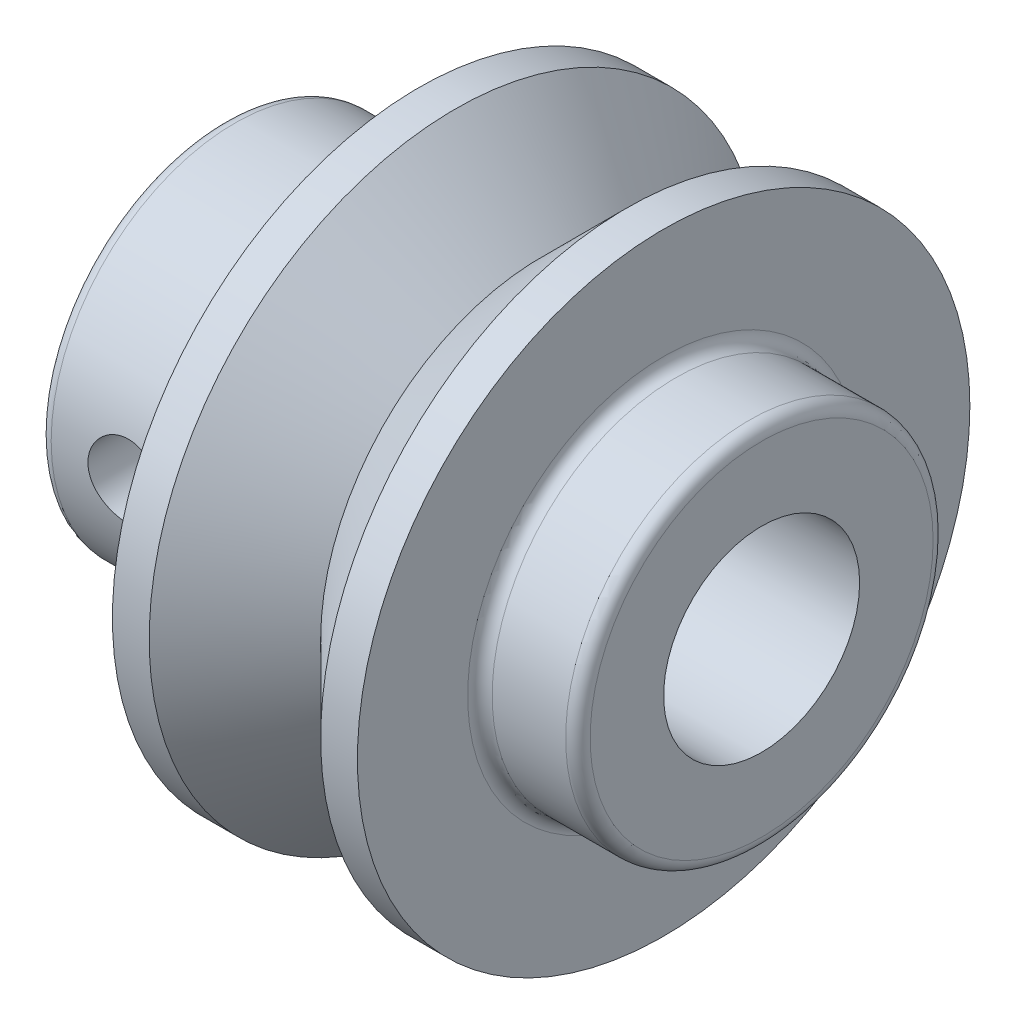
ISO-10303-21;
HEADER;
FILE_DESCRIPTION(('STEP AP214'),'2;1');
FILE_NAME('part.step','',(''),(''),'','','');
FILE_SCHEMA(('AUTOMOTIVE_DESIGN { 1 0 10303 214 1 1 1 1 }'));
ENDSEC;
DATA;
#1=APPLICATION_CONTEXT('core data for automotive mechanical design processes');
#2=APPLICATION_PROTOCOL_DEFINITION('international standard','automotive_design',2000,#1);
#3=PRODUCT_CONTEXT('',#1,'mechanical');
#4=PRODUCT('Part','Part','',(#3));
#5=PRODUCT_RELATED_PRODUCT_CATEGORY('part','',(#4));
#6=PRODUCT_DEFINITION_FORMATION('','',#4);
#7=PRODUCT_DEFINITION_CONTEXT('part definition',#1,'design');
#8=PRODUCT_DEFINITION('design','',#6,#7);
#9=PRODUCT_DEFINITION_SHAPE('','',#8);
#10=(LENGTH_UNIT() NAMED_UNIT(*) SI_UNIT(.MILLI.,.METRE.));
#11=(NAMED_UNIT(*) PLANE_ANGLE_UNIT() SI_UNIT($,.RADIAN.));
#12=(NAMED_UNIT(*) SI_UNIT($,.STERADIAN.) SOLID_ANGLE_UNIT());
#13=UNCERTAINTY_MEASURE_WITH_UNIT(LENGTH_MEASURE(1.E-05),#10,'distance_accuracy_value','');
#14=(GEOMETRIC_REPRESENTATION_CONTEXT(3) GLOBAL_UNCERTAINTY_ASSIGNED_CONTEXT((#13)) GLOBAL_UNIT_ASSIGNED_CONTEXT((#10,
#11,#12)) REPRESENTATION_CONTEXT('',''));
#15=CARTESIAN_POINT('',(0.,0.,0.));
#16=DIRECTION('',(0.,0.,1.));
#17=DIRECTION('',(1.,0.,0.));
#18=AXIS2_PLACEMENT_3D('',#15,#16,#17);
#19=CARTESIAN_POINT('',(0.,0.,0.));
#20=DIRECTION('',(-1.,0.,0.));
#21=DIRECTION('',(0.,0.,1.));
#22=AXIS2_PLACEMENT_3D('',#19,#20,#21);
#23=PLANE('',#22);
#24=CARTESIAN_POINT('',(0.,0.,0.));
#25=DIRECTION('',(-1.,0.,0.));
#26=DIRECTION('',(0.,0.,1.));
#27=AXIS2_PLACEMENT_3D('',#24,#25,#26);
#28=CIRCLE('',#27,7.);
#29=CARTESIAN_POINT('',(0.,0.,7.));
#30=VERTEX_POINT('',#29);
#31=EDGE_CURVE('E55',#30,#30,#28,.T.);
#32=ORIENTED_EDGE('',*,*,#31,.T.);
#33=EDGE_LOOP('',(#32));
#34=FACE_BOUND('',#33,.T.);
#35=CARTESIAN_POINT('',(0.,0.,0.));
#36=DIRECTION('',(1.,0.,0.));
#37=DIRECTION('',(0.,0.,-1.));
#38=AXIS2_PLACEMENT_3D('',#35,#36,#37);
#39=CIRCLE('',#38,4.);
#40=CARTESIAN_POINT('',(0.,0.,-4.));
#41=VERTEX_POINT('',#40);
#42=EDGE_CURVE('E183',#41,#41,#39,.T.);
#43=ORIENTED_EDGE('',*,*,#42,.T.);
#44=EDGE_LOOP('',(#43));
#45=FACE_BOUND('',#44,.T.);
#46=ADVANCED_FACE('F35',(#34,#45),#23,.T.);
#47=CARTESIAN_POINT('',(22.,0.,0.));
#48=DIRECTION('',(1.,0.,0.));
#49=DIRECTION('',(0.,0.,-1.));
#50=AXIS2_PLACEMENT_3D('',#47,#48,#49);
#51=CYLINDRICAL_SURFACE('',#50,7.5);
#52=CARTESIAN_POINT('',(7.5,0.,0.));
#53=DIRECTION('',(-1.,0.,0.));
#54=DIRECTION('',(0.,0.,1.));
#55=AXIS2_PLACEMENT_3D('',#52,#53,#54);
#56=CIRCLE('',#55,7.5);
#57=CARTESIAN_POINT('',(7.5,0.,7.5));
#58=VERTEX_POINT('',#57);
#59=EDGE_CURVE('E58',#58,#58,#56,.T.);
#60=ORIENTED_EDGE('',*,*,#59,.T.);
#61=EDGE_LOOP('',(#60));
#62=FACE_BOUND('',#61,.T.);
#63=CARTESIAN_POINT('',(0.5,0.,0.));
#64=DIRECTION('',(-1.,0.,0.));
#65=DIRECTION('',(0.,0.,1.));
#66=AXIS2_PLACEMENT_3D('',#63,#64,#65);
#67=CIRCLE('',#66,7.5);
#68=CARTESIAN_POINT('',(0.5,0.,7.5));
#69=VERTEX_POINT('',#68);
#70=EDGE_CURVE('E61',#69,#69,#67,.F.);
#71=ORIENTED_EDGE('',*,*,#70,.T.);
#72=EDGE_LOOP('',(#71));
#73=FACE_BOUND('',#72,.T.);
#74=CARTESIAN_POINT('',(2.,0.,-7.5));
#75=CARTESIAN_POINT('',(2.00000306674752,0.0833653601889497,-7.49999846371307));
#76=CARTESIAN_POINT('',(2.00697326445147,0.166769490302283,-7.49859577767346));
#77=CARTESIAN_POINT('',(2.03464775017287,0.331220261533529,-7.49313548434847));
#78=CARTESIAN_POINT('',(2.05536294920227,0.412264976312034,-7.48907576790279));
#79=CARTESIAN_POINT('',(2.10986191043118,0.569595457894969,-7.4787547391743));
#80=CARTESIAN_POINT('',(2.14363315526703,0.645885701899701,-7.47249553615077));
#81=CARTESIAN_POINT('',(2.22324837126694,0.791711983296338,-7.45845597052971));
#82=CARTESIAN_POINT('',(2.26909162341081,0.861248422613717,-7.4506756985356));
#83=CARTESIAN_POINT('',(2.37220774143715,0.992540215972297,-7.43433247994955));
#84=CARTESIAN_POINT('',(2.42961253308681,1.05419092673779,-7.42576118256521));
#85=CARTESIAN_POINT('',(2.55393862458755,1.16705513491204,-7.40886270678882));
#86=CARTESIAN_POINT('',(2.62086066700268,1.21826781715564,-7.40053554750636));
#87=CARTESIAN_POINT('',(2.76307428951781,1.30924763002143,-7.38498662718923));
#88=CARTESIAN_POINT('',(2.83843646569454,1.3489064082988,-7.37777561047419));
#89=CARTESIAN_POINT('',(2.99492272850612,1.41495849987046,-7.36539402087627));
#90=CARTESIAN_POINT('',(3.07604624501952,1.44135312365586,-7.36022324642942));
#91=CARTESIAN_POINT('',(3.24062654586188,1.47978794982724,-7.35259207878307));
#92=CARTESIAN_POINT('',(3.32403881621334,1.49201174693816,-7.35009705160781));
#93=CARTESIAN_POINT('',(3.49176473204651,1.50232819158918,-7.34799562590941));
#94=CARTESIAN_POINT('',(3.57607828448022,1.50042228407025,-7.34838893201761));
#95=CARTESIAN_POINT('',(3.74187018203151,1.48268185965273,-7.35198826722277));
#96=CARTESIAN_POINT('',(3.82337210844097,1.46705781036586,-7.35515179288145));
#97=CARTESIAN_POINT('',(3.9825741149945,1.42265682693457,-7.36386819240002));
#98=CARTESIAN_POINT('',(4.06027401337851,1.39387926465102,-7.36942118036668));
#99=CARTESIAN_POINT('',(4.2102728925554,1.32378717551208,-7.38233427750612));
#100=CARTESIAN_POINT('',(4.28253181935376,1.28238922684817,-7.38970634720557));
#101=CARTESIAN_POINT('',(4.41915627495922,1.18829036185902,-7.40541928159593));
#102=CARTESIAN_POINT('',(4.48352089527674,1.13558814653524,-7.41376025757549));
#103=CARTESIAN_POINT('',(4.6037441036854,1.01924990184087,-7.43065531862193));
#104=CARTESIAN_POINT('',(4.6594288517887,0.955434241818666,-7.43921053816357));
#105=CARTESIAN_POINT('',(4.75933076945184,0.819277536093014,-7.45543273071613));
#106=CARTESIAN_POINT('',(4.80354779194037,0.746936381069083,-7.4630996923346));
#107=CARTESIAN_POINT('',(4.87929126383896,0.59558908031838,-7.47670035241331));
#108=CARTESIAN_POINT('',(4.91079784046681,0.516572729377949,-7.48263133272408));
#109=CARTESIAN_POINT('',(4.96004071105785,0.354223464672997,-7.49207113481787));
#110=CARTESIAN_POINT('',(4.97777867311044,0.270891075108674,-7.49558025000797));
#111=CARTESIAN_POINT('',(4.99873468069141,0.103769108440725,-7.49974007800301));
#112=CARTESIAN_POINT('',(5.0021906293104,0.0200104924883635,-7.50043761978705));
#113=CARTESIAN_POINT('',(4.99512521158673,-0.146887401289072,-7.49902577895154));
#114=CARTESIAN_POINT('',(4.98460463097111,-0.23002671366569,-7.49691655412169));
#115=CARTESIAN_POINT('',(4.95008243968407,-0.392558489919811,-7.49015748012026));
#116=CARTESIAN_POINT('',(4.92620289725315,-0.471977922509855,-7.4855306460631));
#117=CARTESIAN_POINT('',(4.86577402601629,-0.6256854412495,-7.47425328091549));
#118=CARTESIAN_POINT('',(4.82922374798475,-0.699973142456309,-7.4676025982134));
#119=CARTESIAN_POINT('',(4.74397626402303,-0.842311760529326,-7.45289867299942));
#120=CARTESIAN_POINT('',(4.69513582844158,-0.910275190128281,-7.44482925655578));
#121=CARTESIAN_POINT('',(4.58688621318908,-1.03712702867881,-7.42822102244824));
#122=CARTESIAN_POINT('',(4.5274759004002,-1.09601446339614,-7.41968215452582));
#123=CARTESIAN_POINT('',(4.39868997216331,-1.20396088616126,-7.40293955335447));
#124=CARTESIAN_POINT('',(4.32917638366799,-1.25285655367298,-7.39474290349956));
#125=CARTESIAN_POINT('',(4.18278295796498,-1.33827813007681,-7.37976287694291));
#126=CARTESIAN_POINT('',(4.10590341563967,-1.37480453388435,-7.37297944370014));
#127=CARTESIAN_POINT('',(3.94734763077568,-1.43422776237294,-7.36165110876574));
#128=CARTESIAN_POINT('',(3.86569873818452,-1.45719524968658,-7.3570946230828));
#129=CARTESIAN_POINT('',(3.69959981976364,-1.48906297744079,-7.35071155188038));
#130=CARTESIAN_POINT('',(3.61515016068598,-1.49796505233767,-7.34888461036667));
#131=CARTESIAN_POINT('',(3.44748670318352,-1.5013813663012,-7.34818724447069));
#132=CARTESIAN_POINT('',(3.36427827660949,-1.49615368210634,-7.34926378783951));
#133=CARTESIAN_POINT('',(3.19995252514246,-1.47202845615009,-7.35413360226921));
#134=CARTESIAN_POINT('',(3.11883518345779,-1.45313102419395,-7.35792685150754));
#135=CARTESIAN_POINT('',(2.96115843313918,-1.40231785274843,-7.36777896328738));
#136=CARTESIAN_POINT('',(2.88458845924638,-1.37043376007602,-7.37383231528246));
#137=CARTESIAN_POINT('',(2.73784441889834,-1.29458196690241,-7.38752572461255));
#138=CARTESIAN_POINT('',(2.66767088941229,-1.25061325316232,-7.39516591498341));
#139=CARTESIAN_POINT('',(2.53442664177453,-1.15095887217962,-7.41133440784838));
#140=CARTESIAN_POINT('',(2.47149685209861,-1.09508683085277,-7.41987559364549));
#141=CARTESIAN_POINT('',(2.35582069170624,-0.97359655351971,-7.43679122807932));
#142=CARTESIAN_POINT('',(2.30307666452409,-0.907976080730001,-7.44516563794777));
#143=CARTESIAN_POINT('',(2.20874803408033,-0.768026443632369,-7.46090748581957));
#144=CARTESIAN_POINT('',(2.16728599507996,-0.693613326644751,-7.46826346828869));
#145=CARTESIAN_POINT('',(2.09752081610511,-0.538749541411098,-7.481026876275));
#146=CARTESIAN_POINT('',(2.06920581570126,-0.458304391294689,-7.48643605707924));
#147=CARTESIAN_POINT('',(2.03202207793293,-0.314732233385668,-7.49364558893056));
#148=CARTESIAN_POINT('',(2.02003520943836,-0.252422496020676,-7.49601454737677));
#149=CARTESIAN_POINT('',(2.00402313146245,-0.1267492878151,-7.49919231209839));
#150=CARTESIAN_POINT('',(1.99999766823535,-0.0633858506229284,-7.50000116809732));
#151=CARTESIAN_POINT('',(2.,0.,-7.5));
#152=B_SPLINE_CURVE_WITH_KNOTS('',3,(#74,#75,#76,#77,#78,#79,#80,#81,#82,#83,#84,#85,#86,#87,
#88,#89,#90,#91,#92,#93,#94,#95,#96,#97,#98,#99,#100,#101,#102,#103,#104,#105,#106,#107,#108,
#109,#110,#111,#112,#113,#114,#115,#116,#117,#118,#119,#120,#121,#122,#123,#124,#125,#126,#127,
#128,#129,#130,#131,#132,#133,#134,#135,#136,#137,#138,#139,#140,#141,#142,#143,#144,#145,#146,
#147,#148,#149,#150,#151),.UNSPECIFIED.,.T.,.F.,(4,2,2,2,2,2,2,2,2,2,2,2,2,2,2,2,2,2,2,2,2,2,2,
2,2,2,2,2,2,2,2,2,2,2,2,2,2,2,4),(0.,0.249864195991888,0.499926976036985,0.749750602875512,
0.999559353346295,1.25239900516828,1.50525839512105,1.76041792508884,2.01555224047796,
2.26734277655381,2.51910756421838,2.76707590509417,3.01505608880594,3.26471235305389,
3.51439732124506,3.76857378737026,4.0227535130973,4.27732912281036,4.53187388547054,
4.78216103514398,5.03243411486801,5.28045680926085,5.52849808824033,5.77957599050038,
6.03068082518895,6.28560942868838,6.54052783085199,6.79410571549084,7.04765052495622,
7.29659583851552,7.54553915238912,7.79387941879664,8.04224051372799,8.29482114358714,
8.54745981799395,8.80274245013455,9.05779433276278,9.24778162934841,9.43776287056494),.UNSPECIFIED.);
#153=CARTESIAN_POINT('',(2.,0.,-7.5));
#154=VERTEX_POINT('',#153);
#155=EDGE_CURVE('E101',#154,#154,#152,.T.);
#156=ORIENTED_EDGE('',*,*,#155,.F.);
#157=EDGE_LOOP('',(#156));
#158=FACE_BOUND('',#157,.T.);
#159=CARTESIAN_POINT('',(5.,0.,7.5));
#160=CARTESIAN_POINT('',(4.99999693325248,0.0833653601889497,7.49999846371307));
#161=CARTESIAN_POINT('',(4.99302673554853,0.166769490302283,7.49859577767346));
#162=CARTESIAN_POINT('',(4.96535224982713,0.331220261533529,7.49313548434847));
#163=CARTESIAN_POINT('',(4.94463705079773,0.412264976312033,7.48907576790279));
#164=CARTESIAN_POINT('',(4.89013808956881,0.569595457894969,7.4787547391743));
#165=CARTESIAN_POINT('',(4.85636684473297,0.645885701899701,7.47249553615077));
#166=CARTESIAN_POINT('',(4.77675162873306,0.791711983296338,7.45845597052971));
#167=CARTESIAN_POINT('',(4.73090837658919,0.861248422613717,7.4506756985356));
#168=CARTESIAN_POINT('',(4.62779225856285,0.992540215972297,7.43433247994955));
#169=CARTESIAN_POINT('',(4.5703874669132,1.05419092673779,7.42576118256521));
#170=CARTESIAN_POINT('',(4.44606137541245,1.16705513491204,7.40886270678882));
#171=CARTESIAN_POINT('',(4.37913933299732,1.21826781715564,7.40053554750636));
#172=CARTESIAN_POINT('',(4.23692571048219,1.30924763002143,7.38498662718923));
#173=CARTESIAN_POINT('',(4.16156353430546,1.3489064082988,7.37777561047419));
#174=CARTESIAN_POINT('',(4.00507727149388,1.41495849987046,7.36539402087627));
#175=CARTESIAN_POINT('',(3.92395375498048,1.44135312365586,7.36022324642942));
#176=CARTESIAN_POINT('',(3.75937345413812,1.47978794982724,7.35259207878307));
#177=CARTESIAN_POINT('',(3.67596118378666,1.49201174693816,7.35009705160781));
#178=CARTESIAN_POINT('',(3.50823526795349,1.50232819158918,7.34799562590941));
#179=CARTESIAN_POINT('',(3.42392171551978,1.50042228407025,7.34838893201761));
#180=CARTESIAN_POINT('',(3.25812981796849,1.48268185965273,7.35198826722277));
#181=CARTESIAN_POINT('',(3.17662789155903,1.46705781036586,7.35515179288145));
#182=CARTESIAN_POINT('',(3.0174258850055,1.42265682693457,7.36386819240002));
#183=CARTESIAN_POINT('',(2.93972598662149,1.39387926465102,7.36942118036668));
#184=CARTESIAN_POINT('',(2.7897271074446,1.32378717551208,7.38233427750612));
#185=CARTESIAN_POINT('',(2.71746818064624,1.28238922684817,7.38970634720557));
#186=CARTESIAN_POINT('',(2.58084372504078,1.18829036185902,7.40541928159593));
#187=CARTESIAN_POINT('',(2.51647910472326,1.13558814653524,7.41376025757549));
#188=CARTESIAN_POINT('',(2.3962558963146,1.01924990184087,7.43065531862193));
#189=CARTESIAN_POINT('',(2.3405711482113,0.955434241818666,7.43921053816357));
#190=CARTESIAN_POINT('',(2.24066923054816,0.819277536093013,7.45543273071613));
#191=CARTESIAN_POINT('',(2.19645220805963,0.746936381069082,7.4630996923346));
#192=CARTESIAN_POINT('',(2.12070873616104,0.59558908031838,7.47670035241331));
#193=CARTESIAN_POINT('',(2.08920215953319,0.516572729377949,7.48263133272408));
#194=CARTESIAN_POINT('',(2.03995928894215,0.354223464672996,7.49207113481787));
#195=CARTESIAN_POINT('',(2.02222132688956,0.270891075108673,7.49558025000797));
#196=CARTESIAN_POINT('',(2.00126531930858,0.103769108440725,7.49974007800301));
#197=CARTESIAN_POINT('',(1.9978093706896,0.0200104924883637,7.50043761978705));
#198=CARTESIAN_POINT('',(2.00487478841327,-0.146887401289072,7.49902577895154));
#199=CARTESIAN_POINT('',(2.01539536902889,-0.23002671366569,7.49691655412169));
#200=CARTESIAN_POINT('',(2.04991756031594,-0.392558489919812,7.49015748012026));
#201=CARTESIAN_POINT('',(2.07379710274686,-0.471977922509855,7.4855306460631));
#202=CARTESIAN_POINT('',(2.13422597398371,-0.625685441249501,7.47425328091549));
#203=CARTESIAN_POINT('',(2.17077625201525,-0.69997314245631,7.4676025982134));
#204=CARTESIAN_POINT('',(2.25602373597697,-0.842311760529327,7.45289867299942));
#205=CARTESIAN_POINT('',(2.30486417155842,-0.910275190128282,7.44482925655578));
#206=CARTESIAN_POINT('',(2.41311378681092,-1.03712702867881,7.42822102244824));
#207=CARTESIAN_POINT('',(2.4725240995998,-1.09601446339614,7.41968215452582));
#208=CARTESIAN_POINT('',(2.60131002783669,-1.20396088616126,7.40293955335447));
#209=CARTESIAN_POINT('',(2.67082361633201,-1.25285655367298,7.39474290349956));
#210=CARTESIAN_POINT('',(2.81721704203502,-1.33827813007681,7.37976287694291));
#211=CARTESIAN_POINT('',(2.89409658436033,-1.37480453388435,7.37297944370014));
#212=CARTESIAN_POINT('',(3.05265236922432,-1.43422776237294,7.36165110876574));
#213=CARTESIAN_POINT('',(3.13430126181548,-1.45719524968658,7.3570946230828));
#214=CARTESIAN_POINT('',(3.30040018023636,-1.48906297744079,7.35071155188038));
#215=CARTESIAN_POINT('',(3.38484983931402,-1.49796505233767,7.34888461036667));
#216=CARTESIAN_POINT('',(3.55251329681648,-1.5013813663012,7.34818724447069));
#217=CARTESIAN_POINT('',(3.63572172339052,-1.49615368210634,7.34926378783951));
#218=CARTESIAN_POINT('',(3.80004747485754,-1.47202845615009,7.35413360226921));
#219=CARTESIAN_POINT('',(3.88116481654221,-1.45313102419395,7.35792685150754));
#220=CARTESIAN_POINT('',(4.03884156686082,-1.40231785274843,7.36777896328738));
#221=CARTESIAN_POINT('',(4.11541154075362,-1.37043376007602,7.37383231528246));
#222=CARTESIAN_POINT('',(4.26215558110166,-1.2945819669024,7.38752572461255));
#223=CARTESIAN_POINT('',(4.33232911058771,-1.25061325316232,7.39516591498341));
#224=CARTESIAN_POINT('',(4.46557335822547,-1.15095887217962,7.41133440784838));
#225=CARTESIAN_POINT('',(4.52850314790139,-1.09508683085277,7.41987559364549));
#226=CARTESIAN_POINT('',(4.64417930829376,-0.973596553519709,7.43679122807932));
#227=CARTESIAN_POINT('',(4.69692333547591,-0.90797608073,7.44516563794777));
#228=CARTESIAN_POINT('',(4.79125196591967,-0.768026443632368,7.46090748581957));
#229=CARTESIAN_POINT('',(4.83271400492004,-0.69361332664475,7.46826346828869));
#230=CARTESIAN_POINT('',(4.90247918389489,-0.538749541411097,7.481026876275));
#231=CARTESIAN_POINT('',(4.93079418429874,-0.458304391294687,7.48643605707924));
#232=CARTESIAN_POINT('',(4.96797792206707,-0.314732233385667,7.49364558893056));
#233=CARTESIAN_POINT('',(4.97996479056164,-0.252422496020675,7.49601454737678));
#234=CARTESIAN_POINT('',(4.99597686853755,-0.126749287815099,7.49919231209839));
#235=CARTESIAN_POINT('',(5.00000233176465,-0.063385850622928,7.50000116809732));
#236=CARTESIAN_POINT('',(5.,0.,7.5));
#237=B_SPLINE_CURVE_WITH_KNOTS('',3,(#159,#160,#161,#162,#163,#164,#165,#166,#167,#168,#169,
#170,#171,#172,#173,#174,#175,#176,#177,#178,#179,#180,#181,#182,#183,#184,#185,#186,#187,#188,
#189,#190,#191,#192,#193,#194,#195,#196,#197,#198,#199,#200,#201,#202,#203,#204,#205,#206,#207,
#208,#209,#210,#211,#212,#213,#214,#215,#216,#217,#218,#219,#220,#221,#222,#223,#224,#225,#226,
#227,#228,#229,#230,#231,#232,#233,#234,#235,#236),.UNSPECIFIED.,.T.,.F.,(4,2,2,2,2,2,2,2,2,2,2,
2,2,2,2,2,2,2,2,2,2,2,2,2,2,2,2,2,2,2,2,2,2,2,2,2,2,2,4),(0.,0.249864195991887,
0.499926976036985,0.749750602875513,0.999559353346294,1.25239900516828,1.50525839512105,
1.76041792508884,2.01555224047796,2.26734277655381,2.51910756421838,2.76707590509417,
3.01505608880594,3.26471235305389,3.51439732124506,3.76857378737026,4.0227535130973,
4.27732912281036,4.53187388547054,4.78216103514398,5.03243411486801,5.28045680926085,
5.52849808824033,5.77957599050038,6.03068082518895,6.28560942868838,6.540527830852,
6.79410571549085,7.04765052495622,7.29659583851552,7.54553915238912,7.79387941879665,
8.04224051372799,8.29482114358714,8.54745981799395,8.80274245013455,9.05779433276277,
9.2477816293484,9.43776287056494),.UNSPECIFIED.);
#238=CARTESIAN_POINT('',(5.,0.,7.5));
#239=VERTEX_POINT('',#238);
#240=EDGE_CURVE('E76',#239,#239,#237,.T.);
#241=ORIENTED_EDGE('',*,*,#240,.F.);
#242=EDGE_LOOP('',(#241));
#243=FACE_BOUND('',#242,.T.);
#244=ADVANCED_FACE('F106',(#62,#73,#158,#243),#51,.T.);
#245=CARTESIAN_POINT('',(8.,7.5,0.));
#246=DIRECTION('',(-1.,0.,0.));
#247=DIRECTION('',(0.,0.,1.));
#248=AXIS2_PLACEMENT_3D('',#245,#246,#247);
#249=PLANE('',#248);
#250=CARTESIAN_POINT('',(8.,0.,0.));
#251=DIRECTION('',(-1.,0.,0.));
#252=DIRECTION('',(0.,0.,1.));
#253=AXIS2_PLACEMENT_3D('',#250,#251,#252);
#254=CIRCLE('',#253,8.);
#255=CARTESIAN_POINT('',(8.,0.,8.));
#256=VERTEX_POINT('',#255);
#257=EDGE_CURVE('E64',#256,#256,#254,.F.);
#258=ORIENTED_EDGE('',*,*,#257,.T.);
#259=EDGE_LOOP('',(#258));
#260=FACE_BOUND('',#259,.T.);
#261=CARTESIAN_POINT('',(8.,0.,0.));
#262=DIRECTION('',(1.,0.,0.));
#263=DIRECTION('',(0.,0.,-1.));
#264=AXIS2_PLACEMENT_3D('',#261,#262,#263);
#265=CIRCLE('',#264,12.5);
#266=CARTESIAN_POINT('',(8.,0.,-12.5));
#267=VERTEX_POINT('',#266);
#268=EDGE_CURVE('E67',#267,#267,#265,.T.);
#269=ORIENTED_EDGE('',*,*,#268,.F.);
#270=EDGE_LOOP('',(#269));
#271=FACE_BOUND('',#270,.T.);
#272=ADVANCED_FACE('F111',(#260,#271),#249,.T.);
#273=CARTESIAN_POINT('',(22.,0.,0.));
#274=DIRECTION('',(1.,0.,0.));
#275=DIRECTION('',(0.,0.,-1.));
#276=AXIS2_PLACEMENT_3D('',#273,#274,#275);
#277=CYLINDRICAL_SURFACE('',#276,12.5);
#278=ORIENTED_EDGE('',*,*,#268,.T.);
#279=EDGE_LOOP('',(#278));
#280=FACE_BOUND('',#279,.T.);
#281=CARTESIAN_POINT('',(9.5,0.,0.));
#282=DIRECTION('',(1.,0.,0.));
#283=DIRECTION('',(0.,0.,-1.));
#284=AXIS2_PLACEMENT_3D('',#281,#282,#283);
#285=CIRCLE('',#284,12.5);
#286=CARTESIAN_POINT('',(9.5,0.,-12.5));
#287=VERTEX_POINT('',#286);
#288=EDGE_CURVE('E171',#287,#287,#285,.T.);
#289=ORIENTED_EDGE('',*,*,#288,.F.);
#290=EDGE_LOOP('',(#289));
#291=FACE_BOUND('',#290,.T.);
#292=ADVANCED_FACE('F158',(#280,#291),#277,.T.);
#293=CARTESIAN_POINT('',(13.,0.,0.));
#294=DIRECTION('',(-1.,0.,0.));
#295=DIRECTION('',(0.,0.,1.));
#296=AXIS2_PLACEMENT_3D('',#293,#294,#295);
#297=CONICAL_SURFACE('',#296,9.,0.785398163397448);
#298=ORIENTED_EDGE('',*,*,#288,.T.);
#299=EDGE_LOOP('',(#298));
#300=FACE_BOUND('',#299,.T.);
#301=CARTESIAN_POINT('',(13.,0.,0.));
#302=DIRECTION('',(1.,0.,0.));
#303=DIRECTION('',(0.,0.,-1.));
#304=AXIS2_PLACEMENT_3D('',#301,#302,#303);
#305=CIRCLE('',#304,9.);
#306=CARTESIAN_POINT('',(13.,0.,-9.));
#307=VERTEX_POINT('',#306);
#308=EDGE_CURVE('E172',#307,#307,#305,.T.);
#309=ORIENTED_EDGE('',*,*,#308,.F.);
#310=EDGE_LOOP('',(#309));
#311=FACE_BOUND('',#310,.T.);
#312=ADVANCED_FACE('F155',(#300,#311),#297,.T.);
#313=CARTESIAN_POINT('',(16.5,0.,0.));
#314=DIRECTION('',(1.,0.,0.));
#315=DIRECTION('',(0.,0.,-1.));
#316=AXIS2_PLACEMENT_3D('',#313,#314,#315);
#317=CONICAL_SURFACE('',#316,12.5,0.785398163397448);
#318=ORIENTED_EDGE('',*,*,#308,.T.);
#319=EDGE_LOOP('',(#318));
#320=FACE_BOUND('',#319,.T.);
#321=CARTESIAN_POINT('',(16.5,0.,0.));
#322=DIRECTION('',(1.,0.,0.));
#323=DIRECTION('',(0.,0.,-1.));
#324=AXIS2_PLACEMENT_3D('',#321,#322,#323);
#325=CIRCLE('',#324,12.5);
#326=CARTESIAN_POINT('',(16.5,0.,-12.5));
#327=VERTEX_POINT('',#326);
#328=EDGE_CURVE('E175',#327,#327,#325,.T.);
#329=ORIENTED_EDGE('',*,*,#328,.F.);
#330=EDGE_LOOP('',(#329));
#331=FACE_BOUND('',#330,.T.);
#332=ADVANCED_FACE('F151',(#320,#331),#317,.T.);
#333=CARTESIAN_POINT('',(22.,0.,0.));
#334=DIRECTION('',(1.,0.,0.));
#335=DIRECTION('',(0.,0.,-1.));
#336=AXIS2_PLACEMENT_3D('',#333,#334,#335);
#337=CYLINDRICAL_SURFACE('',#336,12.5);
#338=ORIENTED_EDGE('',*,*,#328,.T.);
#339=EDGE_LOOP('',(#338));
#340=FACE_BOUND('',#339,.T.);
#341=CARTESIAN_POINT('',(18.,0.,0.));
#342=DIRECTION('',(1.,0.,0.));
#343=DIRECTION('',(0.,0.,-1.));
#344=AXIS2_PLACEMENT_3D('',#341,#342,#343);
#345=CIRCLE('',#344,12.5);
#346=CARTESIAN_POINT('',(18.,0.,-12.5));
#347=VERTEX_POINT('',#346);
#348=EDGE_CURVE('E180',#347,#347,#345,.T.);
#349=ORIENTED_EDGE('',*,*,#348,.F.);
#350=EDGE_LOOP('',(#349));
#351=FACE_BOUND('',#350,.T.);
#352=ADVANCED_FACE('F146',(#340,#351),#337,.T.);
#353=CARTESIAN_POINT('',(18.,12.5,0.));
#354=DIRECTION('',(1.,0.,0.));
#355=DIRECTION('',(0.,0.,-1.));
#356=AXIS2_PLACEMENT_3D('',#353,#354,#355);
#357=PLANE('',#356);
#358=CARTESIAN_POINT('',(18.,0.,0.));
#359=DIRECTION('',(1.,0.,0.));
#360=DIRECTION('',(0.,0.,-1.));
#361=AXIS2_PLACEMENT_3D('',#358,#359,#360);
#362=CIRCLE('',#361,8.);
#363=CARTESIAN_POINT('',(18.,0.,-8.));
#364=VERTEX_POINT('',#363);
#365=EDGE_CURVE('E42',#364,#364,#362,.F.);
#366=ORIENTED_EDGE('',*,*,#365,.T.);
#367=EDGE_LOOP('',(#366));
#368=FACE_BOUND('',#367,.T.);
#369=ORIENTED_EDGE('',*,*,#348,.T.);
#370=EDGE_LOOP('',(#369));
#371=FACE_BOUND('',#370,.T.);
#372=ADVANCED_FACE('F138',(#368,#371),#357,.T.);
#373=CARTESIAN_POINT('',(22.,0.,0.));
#374=DIRECTION('',(1.,0.,0.));
#375=DIRECTION('',(0.,0.,-1.));
#376=AXIS2_PLACEMENT_3D('',#373,#374,#375);
#377=CYLINDRICAL_SURFACE('',#376,7.5);
#378=CARTESIAN_POINT('',(18.5,0.,0.));
#379=DIRECTION('',(1.,0.,0.));
#380=DIRECTION('',(0.,0.,-1.));
#381=AXIS2_PLACEMENT_3D('',#378,#379,#380);
#382=CIRCLE('',#381,7.5);
#383=CARTESIAN_POINT('',(18.5,0.,-7.5));
#384=VERTEX_POINT('',#383);
#385=EDGE_CURVE('E46',#384,#384,#382,.T.);
#386=ORIENTED_EDGE('',*,*,#385,.T.);
#387=EDGE_LOOP('',(#386));
#388=FACE_BOUND('',#387,.T.);
#389=CARTESIAN_POINT('',(21.5,0.,0.));
#390=DIRECTION('',(1.,0.,0.));
#391=DIRECTION('',(0.,0.,-1.));
#392=AXIS2_PLACEMENT_3D('',#389,#390,#391);
#393=CIRCLE('',#392,7.5);
#394=CARTESIAN_POINT('',(21.5,0.,-7.5));
#395=VERTEX_POINT('',#394);
#396=EDGE_CURVE('E50',#395,#395,#393,.F.);
#397=ORIENTED_EDGE('',*,*,#396,.T.);
#398=EDGE_LOOP('',(#397));
#399=FACE_BOUND('',#398,.T.);
#400=ADVANCED_FACE('F134',(#388,#399),#377,.T.);
#401=CARTESIAN_POINT('',(22.,7.5,0.));
#402=DIRECTION('',(1.,0.,0.));
#403=DIRECTION('',(0.,0.,-1.));
#404=AXIS2_PLACEMENT_3D('',#401,#402,#403);
#405=PLANE('',#404);
#406=CARTESIAN_POINT('',(22.,0.,0.));
#407=DIRECTION('',(1.,0.,0.));
#408=DIRECTION('',(0.,0.,-1.));
#409=AXIS2_PLACEMENT_3D('',#406,#407,#408);
#410=CIRCLE('',#409,7.);
#411=CARTESIAN_POINT('',(22.,0.,-7.));
#412=VERTEX_POINT('',#411);
#413=EDGE_CURVE('E10',#412,#412,#410,.T.);
#414=ORIENTED_EDGE('',*,*,#413,.T.);
#415=EDGE_LOOP('',(#414));
#416=FACE_BOUND('',#415,.T.);
#417=CARTESIAN_POINT('',(22.,0.,0.));
#418=DIRECTION('',(1.,0.,0.));
#419=DIRECTION('',(0.,0.,-1.));
#420=AXIS2_PLACEMENT_3D('',#417,#418,#419);
#421=CIRCLE('',#420,4.);
#422=CARTESIAN_POINT('',(22.,0.,-4.));
#423=VERTEX_POINT('',#422);
#424=EDGE_CURVE('E184',#423,#423,#421,.T.);
#425=ORIENTED_EDGE('',*,*,#424,.F.);
#426=EDGE_LOOP('',(#425));
#427=FACE_BOUND('',#426,.T.);
#428=ADVANCED_FACE('F137',(#416,#427),#405,.T.);
#429=CARTESIAN_POINT('',(0.,0.,0.));
#430=DIRECTION('',(1.,0.,0.));
#431=DIRECTION('',(0.,0.,-1.));
#432=AXIS2_PLACEMENT_3D('',#429,#430,#431);
#433=CYLINDRICAL_SURFACE('',#432,4.);
#434=CARTESIAN_POINT('',(2.,0.,-4.));
#435=CARTESIAN_POINT('',(1.99999709769689,0.0812350589378528,-4.00000217456151));
#436=CARTESIAN_POINT('',(2.00661976024838,0.162450241781792,-3.99750379283184));
#437=CARTESIAN_POINT('',(2.03282819526993,0.322453452352361,-3.98778696006928));
#438=CARTESIAN_POINT('',(2.05241210047057,0.401241827987616,-3.98056918893993));
#439=CARTESIAN_POINT('',(2.10375300177176,0.554060784990879,-3.96218832391545));
#440=CARTESIAN_POINT('',(2.13548651682179,0.628100224162277,-3.9510328434944));
#441=CARTESIAN_POINT('',(2.21010641301582,0.769799310160253,-3.92588767765353));
#442=CARTESIAN_POINT('',(2.25299578554416,0.837457239177879,-3.91189723227548));
#443=CARTESIAN_POINT('',(2.35061253107091,0.967346417045825,-3.88186246971217));
#444=CARTESIAN_POINT('',(2.4057302622594,1.02927073015119,-3.86576002583566));
#445=CARTESIAN_POINT('',(2.52541043465884,1.14324421474363,-3.83360220871327));
#446=CARTESIAN_POINT('',(2.58997575608788,1.19529036359203,-3.81754685135033));
#447=CARTESIAN_POINT('',(2.72971746752321,1.28998202215985,-3.78662470617731));
#448=CARTESIAN_POINT('',(2.80520436654582,1.3321939319576,-3.77182648820818));
#449=CARTESIAN_POINT('',(2.96284835416852,1.40318646334084,-3.74599860237433));
#450=CARTESIAN_POINT('',(3.0450027631551,1.43197244961239,-3.73496742975881));
#451=CARTESIAN_POINT('',(3.2101167402582,1.47408431017549,-3.71854412824136));
#452=CARTESIAN_POINT('',(3.29290503843544,1.48799593218558,-3.71293924350838));
#453=CARTESIAN_POINT('',(3.45981615799384,1.50179556531648,-3.70738061461215));
#454=CARTESIAN_POINT('',(3.54393841387447,1.5016893680263,-3.70742453659305));
#455=CARTESIAN_POINT('',(3.70576952521296,1.48790429610018,-3.71297511632055));
#456=CARTESIAN_POINT('',(3.78356090604418,1.47503808509003,-3.71815468871122));
#457=CARTESIAN_POINT('',(3.93578715040532,1.4374416786833,-3.7328493805953));
#458=CARTESIAN_POINT('',(4.01022150661388,1.41270969663258,-3.74236515298863));
#459=CARTESIAN_POINT('',(4.15527706772823,1.35163748571904,-3.76485702190253));
#460=CARTESIAN_POINT('',(4.2257994861213,1.31508648737101,-3.77789517988166));
#461=CARTESIAN_POINT('',(4.35994573759097,1.23156073762698,-3.80594210139319));
#462=CARTESIAN_POINT('',(4.4235671775197,1.18458238728896,-3.82095154457158));
#463=CARTESIAN_POINT('',(4.54660366365088,1.07781780766549,-3.85248038859113));
#464=CARTESIAN_POINT('',(4.60544864074809,1.01738298716955,-3.86903347455671));
#465=CARTESIAN_POINT('',(4.7123379662058,0.887312590819019,-3.90091728164086));
#466=CARTESIAN_POINT('',(4.76038065460567,0.817675603497363,-3.91624781465952));
#467=CARTESIAN_POINT('',(4.84493039706252,0.669723436992419,-3.9442639480908));
#468=CARTESIAN_POINT('',(4.88124758122106,0.591290713844718,-3.95690498259616));
#469=CARTESIAN_POINT('',(4.93998260427004,0.428836850524582,-3.97778718326962));
#470=CARTESIAN_POINT('',(4.96240661656112,0.344818210845767,-3.98603030341493));
#471=CARTESIAN_POINT('',(4.99162278754194,0.178375243148664,-3.99684443228065));
#472=CARTESIAN_POINT('',(4.99918260638251,0.0961036195622086,-3.99969369025686));
#473=CARTESIAN_POINT('',(5.00069106389992,-0.068572475255025,-4.00025893700126));
#474=CARTESIAN_POINT('',(4.99464272031678,-0.150976912983374,-3.99797606386863));
#475=CARTESIAN_POINT('',(4.96968995769133,-0.31026204856186,-3.98871709772643));
#476=CARTESIAN_POINT('',(4.95128845626291,-0.387233328007337,-3.98192470962305));
#477=CARTESIAN_POINT('',(4.90281392745268,-0.536941754957222,-3.96451477091717));
#478=CARTESIAN_POINT('',(4.87273938205196,-0.609678350347535,-3.9538967228203));
#479=CARTESIAN_POINT('',(4.80081358756052,-0.751247765110156,-3.92949624407681));
#480=CARTESIAN_POINT('',(4.75864227077661,-0.819903083557796,-3.91563000209348));
#481=CARTESIAN_POINT('',(4.66408189682844,-0.949392711726626,-3.88626671564664));
#482=CARTESIAN_POINT('',(4.61168906745485,-1.01022412027045,-3.87076907009516));
#483=CARTESIAN_POINT('',(4.49459587787572,-1.12603079874454,-3.8387332949099));
#484=CARTESIAN_POINT('',(4.4293578172273,-1.18046154123568,-3.82218696503729));
#485=CARTESIAN_POINT('',(4.29034861529234,-1.27771050031903,-3.79078815746854));
#486=CARTESIAN_POINT('',(4.2165767086115,-1.32052767414518,-3.77593583194399));
#487=CARTESIAN_POINT('',(4.06198401322769,-1.39337773518998,-3.74966829822463));
#488=CARTESIAN_POINT('',(3.98113525408956,-1.42335685446918,-3.73826760328493));
#489=CARTESIAN_POINT('',(3.81499023631218,-1.46907883466889,-3.72054032891005));
#490=CARTESIAN_POINT('',(3.72969676380188,-1.48483050305535,-3.71421061057491));
#491=CARTESIAN_POINT('',(3.56298384045888,-1.50086347097839,-3.70775894792573));
#492=CARTESIAN_POINT('',(3.48166736828311,-1.50207331495837,-3.70726444523341));
#493=CARTESIAN_POINT('',(3.32005468372383,-1.49136715641593,-3.71158412745292));
#494=CARTESIAN_POINT('',(3.23975837532842,-1.47945239850123,-3.71639780898899));
#495=CARTESIAN_POINT('',(3.08495277328345,-1.44355815630241,-3.73048141585432));
#496=CARTESIAN_POINT('',(3.01034165375465,-1.41995798316524,-3.73961085376663));
#497=CARTESIAN_POINT('',(2.86609449150558,-1.36169696779919,-3.76121548297845));
#498=CARTESIAN_POINT('',(2.79645971192986,-1.32703332944944,-3.77369151995215));
#499=CARTESIAN_POINT('',(2.66017321030237,-1.24552075938154,-3.80139723903965));
#500=CARTESIAN_POINT('',(2.59386920320009,-1.1981283280301,-3.81673698440964));
#501=CARTESIAN_POINT('',(2.4698584390288,-1.09334485729906,-3.84806246757177));
#502=CARTESIAN_POINT('',(2.41215442521325,-1.03595064012808,-3.86404840943145));
#503=CARTESIAN_POINT('',(2.30379804417816,-0.909080396784621,-3.89590424609881));
#504=CARTESIAN_POINT('',(2.25369624656533,-0.83911864421299,-3.91172104900645));
#505=CARTESIAN_POINT('',(2.16597734472344,-0.691213223200819,-3.94054514457031));
#506=CARTESIAN_POINT('',(2.12836121226363,-0.613268934090619,-3.95355221851559));
#507=CARTESIAN_POINT('',(2.06562317095167,-0.44799908200231,-3.9757429260668));
#508=CARTESIAN_POINT('',(2.0411129353981,-0.360413422234207,-3.98473657158356));
#509=CARTESIAN_POINT('',(2.00830704007932,-0.181875733606382,-3.99686242179587));
#510=CARTESIAN_POINT('',(2.00000324851268,-0.0909254163648588,-3.99999756603967));
#511=CARTESIAN_POINT('',(2.,0.,-4.));
#512=B_SPLINE_CURVE_WITH_KNOTS('',3,(#434,#435,#436,#437,#438,#439,#440,#441,#442,#443,#444,
#445,#446,#447,#448,#449,#450,#451,#452,#453,#454,#455,#456,#457,#458,#459,#460,#461,#462,#463,
#464,#465,#466,#467,#468,#469,#470,#471,#472,#473,#474,#475,#476,#477,#478,#479,#480,#481,#482,
#483,#484,#485,#486,#487,#488,#489,#490,#491,#492,#493,#494,#495,#496,#497,#498,#499,#500,#501,
#502,#503,#504,#505,#506,#507,#508,#509,#510,#511),.UNSPECIFIED.,.T.,.F.,(4,2,2,2,2,2,2,2,2,2,2,
2,2,2,2,2,2,2,2,2,2,2,2,2,2,2,2,2,2,2,2,2,2,2,2,2,2,2,4),(0.,0.24336980156056,0.48670454953046,
0.729571369213573,0.972503379609489,1.22473618582715,1.47704604925622,1.73896674501658,
2.00078269352134,2.25185874416901,2.50283106079707,2.73878345119971,2.97477138060589,
3.21522408387018,3.45575990744258,3.71246153335813,3.96920257905066,4.22991375286075,
4.49050899698845,4.73725019635925,4.9839366839052,5.2211443792384,5.45838293254453,
5.70259221859599,5.94689180019868,6.20536519455657,6.46386178920141,6.72343066727204,
6.98283874956507,7.22558763480252,7.46831350211259,7.70363142426533,7.93900886656506,
8.18672471884271,8.43451941997061,8.69572329654039,8.95694749805102,9.22948515032042,
9.50188601796127),.UNSPECIFIED.);
#513=CARTESIAN_POINT('',(2.,0.,-4.));
#514=VERTEX_POINT('',#513);
#515=EDGE_CURVE('E68',#514,#514,#512,.T.);
#516=ORIENTED_EDGE('',*,*,#515,.T.);
#517=EDGE_LOOP('',(#516));
#518=FACE_BOUND('',#517,.T.);
#519=CARTESIAN_POINT('',(5.,0.,4.));
#520=CARTESIAN_POINT('',(5.00000290230311,0.0812350589378529,4.00000217456151));
#521=CARTESIAN_POINT('',(4.99338023975162,0.162450241781792,3.99750379283184));
#522=CARTESIAN_POINT('',(4.96717180473007,0.322453452352361,3.98778696006928));
#523=CARTESIAN_POINT('',(4.94758789952943,0.401241827987616,3.98056918893993));
#524=CARTESIAN_POINT('',(4.89624699822824,0.554060784990879,3.96218832391545));
#525=CARTESIAN_POINT('',(4.86451348317821,0.628100224162277,3.9510328434944));
#526=CARTESIAN_POINT('',(4.78989358698418,0.769799310160253,3.92588767765353));
#527=CARTESIAN_POINT('',(4.74700421445584,0.837457239177879,3.91189723227548));
#528=CARTESIAN_POINT('',(4.64938746892909,0.967346417045825,3.88186246971217));
#529=CARTESIAN_POINT('',(4.5942697377406,1.02927073015119,3.86576002583566));
#530=CARTESIAN_POINT('',(4.47458956534116,1.14324421474363,3.83360220871327));
#531=CARTESIAN_POINT('',(4.41002424391212,1.19529036359203,3.81754685135033));
#532=CARTESIAN_POINT('',(4.27028253247679,1.28998202215985,3.78662470617731));
#533=CARTESIAN_POINT('',(4.19479563345418,1.3321939319576,3.77182648820818));
#534=CARTESIAN_POINT('',(4.03715164583148,1.40318646334084,3.74599860237433));
#535=CARTESIAN_POINT('',(3.9549972368449,1.43197244961239,3.73496742975881));
#536=CARTESIAN_POINT('',(3.7898832597418,1.47408431017549,3.71854412824136));
#537=CARTESIAN_POINT('',(3.70709496156456,1.48799593218558,3.71293924350838));
#538=CARTESIAN_POINT('',(3.54018384200616,1.50179556531648,3.70738061461215));
#539=CARTESIAN_POINT('',(3.45606158612553,1.5016893680263,3.70742453659305));
#540=CARTESIAN_POINT('',(3.29423047478704,1.48790429610018,3.71297511632055));
#541=CARTESIAN_POINT('',(3.21643909395582,1.47503808509003,3.71815468871122));
#542=CARTESIAN_POINT('',(3.06421284959468,1.4374416786833,3.7328493805953));
#543=CARTESIAN_POINT('',(2.98977849338612,1.41270969663258,3.74236515298863));
#544=CARTESIAN_POINT('',(2.84472293227177,1.35163748571904,3.76485702190253));
#545=CARTESIAN_POINT('',(2.7742005138787,1.315086487371,3.77789517988166));
#546=CARTESIAN_POINT('',(2.64005426240903,1.23156073762698,3.80594210139319));
#547=CARTESIAN_POINT('',(2.5764328224803,1.18458238728896,3.82095154457158));
#548=CARTESIAN_POINT('',(2.45339633634912,1.07781780766549,3.85248038859113));
#549=CARTESIAN_POINT('',(2.39455135925191,1.01738298716955,3.86903347455671));
#550=CARTESIAN_POINT('',(2.2876620337942,0.88731259081902,3.90091728164085));
#551=CARTESIAN_POINT('',(2.23961934539433,0.817675603497363,3.91624781465952));
#552=CARTESIAN_POINT('',(2.15506960293748,0.669723436992419,3.9442639480908));
#553=CARTESIAN_POINT('',(2.11875241877894,0.591290713844719,3.95690498259616));
#554=CARTESIAN_POINT('',(2.06001739572996,0.428836850524583,3.97778718326962));
#555=CARTESIAN_POINT('',(2.03759338343888,0.344818210845767,3.98603030341493));
#556=CARTESIAN_POINT('',(2.00837721245806,0.178375243148665,3.99684443228065));
#557=CARTESIAN_POINT('',(2.00081739361749,0.0961036195622094,3.99969369025686));
#558=CARTESIAN_POINT('',(1.99930893610008,-0.0685724752550241,4.00025893700126));
#559=CARTESIAN_POINT('',(2.00535727968322,-0.150976912983372,3.99797606386863));
#560=CARTESIAN_POINT('',(2.03031004230867,-0.310262048561859,3.98871709772643));
#561=CARTESIAN_POINT('',(2.04871154373709,-0.387233328007335,3.98192470962305));
#562=CARTESIAN_POINT('',(2.09718607254732,-0.53694175495722,3.96451477091717));
#563=CARTESIAN_POINT('',(2.12726061794804,-0.609678350347534,3.9538967228203));
#564=CARTESIAN_POINT('',(2.19918641243948,-0.751247765110155,3.92949624407681));
#565=CARTESIAN_POINT('',(2.24135772922339,-0.819903083557795,3.91563000209348));
#566=CARTESIAN_POINT('',(2.33591810317156,-0.949392711726625,3.88626671564664));
#567=CARTESIAN_POINT('',(2.38831093254515,-1.01022412027045,3.87076907009516));
#568=CARTESIAN_POINT('',(2.50540412212428,-1.12603079874454,3.8387332949099));
#569=CARTESIAN_POINT('',(2.5706421827727,-1.18046154123568,3.82218696503729));
#570=CARTESIAN_POINT('',(2.70965138470766,-1.27771050031903,3.79078815746854));
#571=CARTESIAN_POINT('',(2.7834232913885,-1.32052767414518,3.77593583194399));
#572=CARTESIAN_POINT('',(2.93801598677231,-1.39337773518998,3.74966829822463));
#573=CARTESIAN_POINT('',(3.01886474591044,-1.42335685446918,3.73826760328493));
#574=CARTESIAN_POINT('',(3.18500976368782,-1.46907883466889,3.72054032891005));
#575=CARTESIAN_POINT('',(3.27030323619812,-1.48483050305535,3.71421061057491));
#576=CARTESIAN_POINT('',(3.43701615954111,-1.50086347097839,3.70775894792573));
#577=CARTESIAN_POINT('',(3.51833263171689,-1.50207331495837,3.70726444523341));
#578=CARTESIAN_POINT('',(3.67994531627617,-1.49136715641593,3.71158412745292));
#579=CARTESIAN_POINT('',(3.76024162467158,-1.47945239850123,3.71639780898899));
#580=CARTESIAN_POINT('',(3.91504722671655,-1.44355815630241,3.73048141585432));
#581=CARTESIAN_POINT('',(3.98965834624534,-1.41995798316524,3.73961085376663));
#582=CARTESIAN_POINT('',(4.13390550849442,-1.3616969677992,3.76121548297845));
#583=CARTESIAN_POINT('',(4.20354028807014,-1.32703332944944,3.77369151995215));
#584=CARTESIAN_POINT('',(4.33982678969763,-1.24552075938154,3.80139723903965));
#585=CARTESIAN_POINT('',(4.40613079679991,-1.1981283280301,3.81673698440964));
#586=CARTESIAN_POINT('',(4.5301415609712,-1.09334485729906,3.84806246757177));
#587=CARTESIAN_POINT('',(4.58784557478675,-1.03595064012808,3.86404840943145));
#588=CARTESIAN_POINT('',(4.69620195582184,-0.909080396784622,3.89590424609881));
#589=CARTESIAN_POINT('',(4.74630375343467,-0.839118644212991,3.91172104900645));
#590=CARTESIAN_POINT('',(4.83402265527656,-0.69121322320082,3.94054514457031));
#591=CARTESIAN_POINT('',(4.87163878773637,-0.613268934090621,3.95355221851559));
#592=CARTESIAN_POINT('',(4.93437682904833,-0.447999082002312,3.9757429260668));
#593=CARTESIAN_POINT('',(4.95888706460189,-0.360413422234208,3.98473657158356));
#594=CARTESIAN_POINT('',(4.99169295992068,-0.181875733606382,3.99686242179587));
#595=CARTESIAN_POINT('',(4.99999675148732,-0.0909254163648589,3.99999756603967));
#596=CARTESIAN_POINT('',(5.,0.,4.));
#597=B_SPLINE_CURVE_WITH_KNOTS('',3,(#519,#520,#521,#522,#523,#524,#525,#526,#527,#528,#529,
#530,#531,#532,#533,#534,#535,#536,#537,#538,#539,#540,#541,#542,#543,#544,#545,#546,#547,#548,
#549,#550,#551,#552,#553,#554,#555,#556,#557,#558,#559,#560,#561,#562,#563,#564,#565,#566,#567,
#568,#569,#570,#571,#572,#573,#574,#575,#576,#577,#578,#579,#580,#581,#582,#583,#584,#585,#586,
#587,#588,#589,#590,#591,#592,#593,#594,#595,#596),.UNSPECIFIED.,.T.,.F.,(4,2,2,2,2,2,2,2,2,2,2,
2,2,2,2,2,2,2,2,2,2,2,2,2,2,2,2,2,2,2,2,2,2,2,2,2,2,2,4),(0.,0.24336980156056,0.48670454953046,
0.729571369213573,0.972503379609489,1.22473618582715,1.47704604925622,1.73896674501658,
2.00078269352134,2.25185874416901,2.50283106079707,2.73878345119971,2.97477138060589,
3.21522408387018,3.45575990744258,3.71246153335812,3.96920257905066,4.22991375286075,
4.49050899698845,4.73725019635925,4.9839366839052,5.22114437923839,5.45838293254453,
5.70259221859599,5.94689180019867,6.20536519455657,6.4638617892014,6.72343066727203,
6.98283874956506,7.22558763480251,7.46831350211258,7.70363142426533,7.93900886656506,
8.1867247188427,8.43451941997061,8.69572329654038,8.95694749805101,9.22948515032041,
9.50188601796127),.UNSPECIFIED.);
#598=CARTESIAN_POINT('',(5.,0.,4.));
#599=VERTEX_POINT('',#598);
#600=EDGE_CURVE('E77',#599,#599,#597,.T.);
#601=ORIENTED_EDGE('',*,*,#600,.T.);
#602=EDGE_LOOP('',(#601));
#603=FACE_BOUND('',#602,.T.);
#604=ORIENTED_EDGE('',*,*,#42,.F.);
#605=EDGE_LOOP('',(#604));
#606=FACE_BOUND('',#605,.T.);
#607=ORIENTED_EDGE('',*,*,#424,.T.);
#608=EDGE_LOOP('',(#607));
#609=FACE_BOUND('',#608,.T.);
#610=ADVANCED_FACE('F82',(#518,#603,#606,#609),#433,.F.);
#611=CARTESIAN_POINT('',(3.5,0.,-20.));
#612=DIRECTION('',(0.,0.,1.));
#613=DIRECTION('',(1.,0.,0.));
#614=AXIS2_PLACEMENT_3D('',#611,#612,#613);
#615=CYLINDRICAL_SURFACE('',#614,1.5);
#616=ORIENTED_EDGE('',*,*,#240,.T.);
#617=EDGE_LOOP('',(#616));
#618=FACE_BOUND('',#617,.T.);
#619=ORIENTED_EDGE('',*,*,#600,.F.);
#620=EDGE_LOOP('',(#619));
#621=FACE_BOUND('',#620,.T.);
#622=ADVANCED_FACE('F89',(#618,#621),#615,.F.);
#623=ORIENTED_EDGE('',*,*,#155,.T.);
#624=EDGE_LOOP('',(#623));
#625=FACE_BOUND('',#624,.T.);
#626=ORIENTED_EDGE('',*,*,#515,.F.);
#627=EDGE_LOOP('',(#626));
#628=FACE_BOUND('',#627,.T.);
#629=ADVANCED_FACE('F85',(#625,#628),#615,.F.);
#630=CARTESIAN_POINT('',(7.5,0.,0.));
#631=DIRECTION('',(-1.,0.,0.));
#632=DIRECTION('',(0.,0.,1.));
#633=AXIS2_PLACEMENT_3D('',#630,#631,#632);
#634=TOROIDAL_SURFACE('',#633,8.,0.5);
#635=ORIENTED_EDGE('',*,*,#59,.F.);
#636=EDGE_LOOP('',(#635));
#637=FACE_BOUND('',#636,.T.);
#638=ORIENTED_EDGE('',*,*,#257,.F.);
#639=EDGE_LOOP('',(#638));
#640=FACE_BOUND('',#639,.T.);
#641=ADVANCED_FACE('F88',(#637,#640),#634,.F.);
#642=CARTESIAN_POINT('',(0.5,0.,0.));
#643=DIRECTION('',(-1.,0.,0.));
#644=DIRECTION('',(0.,0.,1.));
#645=AXIS2_PLACEMENT_3D('',#642,#643,#644);
#646=TOROIDAL_SURFACE('',#645,7.,0.5);
#647=ORIENTED_EDGE('',*,*,#31,.F.);
#648=EDGE_LOOP('',(#647));
#649=FACE_BOUND('',#648,.T.);
#650=ORIENTED_EDGE('',*,*,#70,.F.);
#651=EDGE_LOOP('',(#650));
#652=FACE_BOUND('',#651,.T.);
#653=ADVANCED_FACE('F120',(#649,#652),#646,.T.);
#654=CARTESIAN_POINT('',(18.5,0.,0.));
#655=DIRECTION('',(1.,0.,0.));
#656=DIRECTION('',(0.,0.,-1.));
#657=AXIS2_PLACEMENT_3D('',#654,#655,#656);
#658=TOROIDAL_SURFACE('',#657,8.,0.5);
#659=ORIENTED_EDGE('',*,*,#365,.F.);
#660=EDGE_LOOP('',(#659));
#661=FACE_BOUND('',#660,.T.);
#662=ORIENTED_EDGE('',*,*,#385,.F.);
#663=EDGE_LOOP('',(#662));
#664=FACE_BOUND('',#663,.T.);
#665=ADVANCED_FACE('F123',(#661,#664),#658,.F.);
#666=CARTESIAN_POINT('',(21.5,0.,0.));
#667=DIRECTION('',(1.,0.,0.));
#668=DIRECTION('',(0.,0.,-1.));
#669=AXIS2_PLACEMENT_3D('',#666,#667,#668);
#670=TOROIDAL_SURFACE('',#669,7.,0.5);
#671=ORIENTED_EDGE('',*,*,#396,.F.);
#672=EDGE_LOOP('',(#671));
#673=FACE_BOUND('',#672,.T.);
#674=ORIENTED_EDGE('',*,*,#413,.F.);
#675=EDGE_LOOP('',(#674));
#676=FACE_BOUND('',#675,.T.);
#677=ADVANCED_FACE('F37',(#673,#676),#670,.T.);
#678=CLOSED_SHELL('',(#46,#244,#272,#292,#312,#332,#352,#372,#400,#428,#610,#622,#629,#641,#653,
#665,#677));
#679=MANIFOLD_SOLID_BREP('B2',#678);
#680=ADVANCED_BREP_SHAPE_REPRESENTATION('',(#18,#679),#14);
#681=SHAPE_DEFINITION_REPRESENTATION(#9,#680);
ENDSEC;
END-ISO-10303-21;
